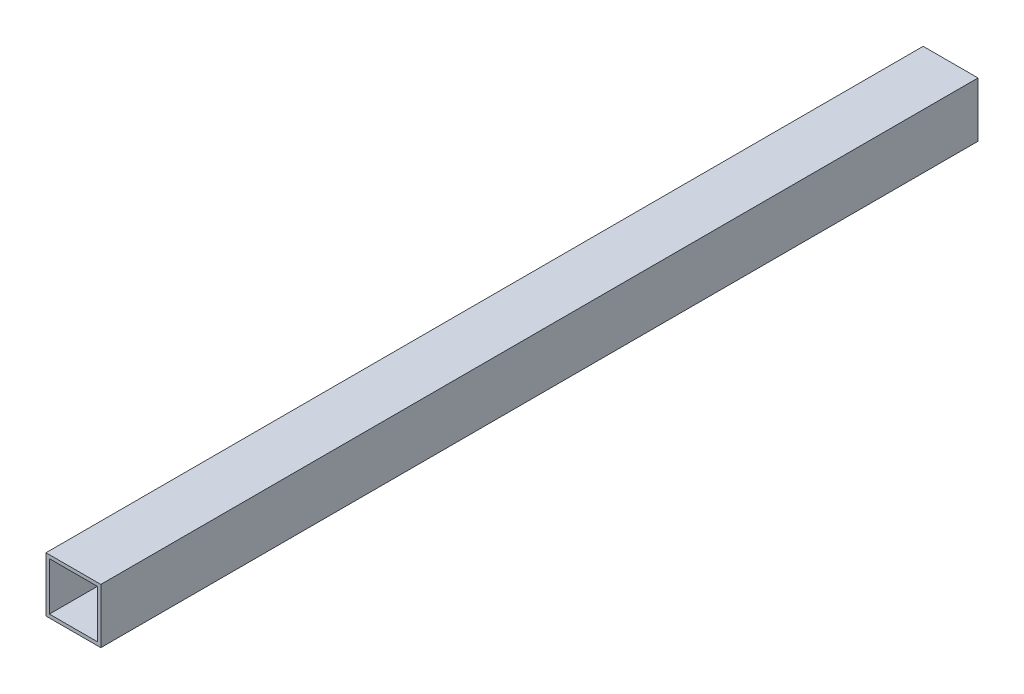
ISO-10303-21;
HEADER;
FILE_DESCRIPTION(('STEP AP214'),'2;1');
FILE_NAME('part.step','',(''),(''),'','','');
FILE_SCHEMA(('AUTOMOTIVE_DESIGN { 1 0 10303 214 1 1 1 1 }'));
ENDSEC;
DATA;
#1=APPLICATION_CONTEXT('core data for automotive mechanical design processes');
#2=APPLICATION_PROTOCOL_DEFINITION('international standard','automotive_design',2000,#1);
#3=PRODUCT_CONTEXT('',#1,'mechanical');
#4=PRODUCT('Part','Part','',(#3));
#5=PRODUCT_RELATED_PRODUCT_CATEGORY('part','',(#4));
#6=PRODUCT_DEFINITION_FORMATION('','',#4);
#7=PRODUCT_DEFINITION_CONTEXT('part definition',#1,'design');
#8=PRODUCT_DEFINITION('design','',#6,#7);
#9=PRODUCT_DEFINITION_SHAPE('','',#8);
#10=(LENGTH_UNIT() NAMED_UNIT(*) SI_UNIT(.MILLI.,.METRE.));
#11=(NAMED_UNIT(*) PLANE_ANGLE_UNIT() SI_UNIT($,.RADIAN.));
#12=(NAMED_UNIT(*) SI_UNIT($,.STERADIAN.) SOLID_ANGLE_UNIT());
#13=UNCERTAINTY_MEASURE_WITH_UNIT(LENGTH_MEASURE(1.E-05),#10,'distance_accuracy_value','');
#14=(GEOMETRIC_REPRESENTATION_CONTEXT(3) GLOBAL_UNCERTAINTY_ASSIGNED_CONTEXT((#13)) GLOBAL_UNIT_ASSIGNED_CONTEXT((#10,
#11,#12)) REPRESENTATION_CONTEXT('',''));
#15=CARTESIAN_POINT('',(0.,0.,0.));
#16=DIRECTION('',(0.,0.,1.));
#17=DIRECTION('',(1.,0.,0.));
#18=AXIS2_PLACEMENT_3D('',#15,#16,#17);
#19=CARTESIAN_POINT('',(0.,0.,812.8));
#20=DIRECTION('',(0.,0.,-1.));
#21=DIRECTION('',(-1.,0.,0.));
#22=AXIS2_PLACEMENT_3D('',#19,#20,#21);
#23=PLANE('',#22);
#24=DIRECTION('',(0.,1.,0.));
#25=VECTOR('',#24,1.);
#26=CARTESIAN_POINT('',(25.4,-25.4,812.8));
#27=LINE('',#26,#25);
#28=CARTESIAN_POINT('',(25.4,-25.4,812.8));
#29=VERTEX_POINT('',#28);
#30=CARTESIAN_POINT('',(25.4,25.4,812.8));
#31=VERTEX_POINT('',#30);
#32=EDGE_CURVE('E134',#29,#31,#27,.T.);
#33=ORIENTED_EDGE('',*,*,#32,.T.);
#34=DIRECTION('',(-1.,0.,0.));
#35=VECTOR('',#34,1.);
#36=CARTESIAN_POINT('',(-25.4,25.4,812.8));
#37=LINE('',#36,#35);
#38=CARTESIAN_POINT('',(-25.4,25.4,812.8));
#39=VERTEX_POINT('',#38);
#40=EDGE_CURVE('E137',#31,#39,#37,.T.);
#41=ORIENTED_EDGE('',*,*,#40,.T.);
#42=DIRECTION('',(0.,-1.,0.));
#43=VECTOR('',#42,1.);
#44=CARTESIAN_POINT('',(-25.4,-25.4,812.8));
#45=LINE('',#44,#43);
#46=CARTESIAN_POINT('',(-25.4,-25.4,812.8));
#47=VERTEX_POINT('',#46);
#48=EDGE_CURVE('E140',#39,#47,#45,.T.);
#49=ORIENTED_EDGE('',*,*,#48,.T.);
#50=DIRECTION('',(1.,0.,0.));
#51=VECTOR('',#50,1.);
#52=CARTESIAN_POINT('',(-25.4,-25.4,812.8));
#53=LINE('',#52,#51);
#54=EDGE_CURVE('E142',#47,#29,#53,.T.);
#55=ORIENTED_EDGE('',*,*,#54,.T.);
#56=EDGE_LOOP('',(#33,#41,#49,#55));
#57=FACE_BOUND('',#56,.T.);
#58=DIRECTION('',(0.,1.,0.));
#59=VECTOR('',#58,1.);
#60=CARTESIAN_POINT('',(22.225,-22.225,812.8));
#61=LINE('',#60,#59);
#62=CARTESIAN_POINT('',(22.225,-22.225,812.8));
#63=VERTEX_POINT('',#62);
#64=CARTESIAN_POINT('',(22.225,22.225,812.8));
#65=VERTEX_POINT('',#64);
#66=EDGE_CURVE('E98',#63,#65,#61,.T.);
#67=ORIENTED_EDGE('',*,*,#66,.F.);
#68=DIRECTION('',(1.,0.,0.));
#69=VECTOR('',#68,1.);
#70=CARTESIAN_POINT('',(-22.225,-22.225,812.8));
#71=LINE('',#70,#69);
#72=CARTESIAN_POINT('',(-22.225,-22.225,812.8));
#73=VERTEX_POINT('',#72);
#74=EDGE_CURVE('E120',#73,#63,#71,.T.);
#75=ORIENTED_EDGE('',*,*,#74,.F.);
#76=DIRECTION('',(0.,-1.,0.));
#77=VECTOR('',#76,1.);
#78=CARTESIAN_POINT('',(-22.225,-22.225,812.8));
#79=LINE('',#78,#77);
#80=CARTESIAN_POINT('',(-22.225,22.225,812.8));
#81=VERTEX_POINT('',#80);
#82=EDGE_CURVE('E118',#81,#73,#79,.T.);
#83=ORIENTED_EDGE('',*,*,#82,.F.);
#84=DIRECTION('',(-1.,0.,0.));
#85=VECTOR('',#84,1.);
#86=CARTESIAN_POINT('',(-22.225,22.225,812.8));
#87=LINE('',#86,#85);
#88=EDGE_CURVE('E106',#65,#81,#87,.T.);
#89=ORIENTED_EDGE('',*,*,#88,.F.);
#90=EDGE_LOOP('',(#67,#75,#83,#89));
#91=FACE_BOUND('',#90,.T.);
#92=ADVANCED_FACE('F33',(#57,#91),#23,.F.);
#93=CARTESIAN_POINT('',(0.,0.,0.));
#94=DIRECTION('',(0.,0.,-1.));
#95=DIRECTION('',(-1.,0.,0.));
#96=AXIS2_PLACEMENT_3D('',#93,#94,#95);
#97=PLANE('',#96);
#98=DIRECTION('',(0.,1.,0.));
#99=VECTOR('',#98,1.);
#100=CARTESIAN_POINT('',(25.4,-25.4,0.));
#101=LINE('',#100,#99);
#102=CARTESIAN_POINT('',(25.4,-25.4,0.));
#103=VERTEX_POINT('',#102);
#104=CARTESIAN_POINT('',(25.4,25.4,0.));
#105=VERTEX_POINT('',#104);
#106=EDGE_CURVE('E114',#103,#105,#101,.T.);
#107=ORIENTED_EDGE('',*,*,#106,.F.);
#108=DIRECTION('',(1.,0.,0.));
#109=VECTOR('',#108,1.);
#110=CARTESIAN_POINT('',(-25.4,-25.4,0.));
#111=LINE('',#110,#109);
#112=CARTESIAN_POINT('',(-25.4,-25.4,0.));
#113=VERTEX_POINT('',#112);
#114=EDGE_CURVE('E138',#113,#103,#111,.T.);
#115=ORIENTED_EDGE('',*,*,#114,.F.);
#116=DIRECTION('',(0.,-1.,0.));
#117=VECTOR('',#116,1.);
#118=CARTESIAN_POINT('',(-25.4,-25.4,0.));
#119=LINE('',#118,#117);
#120=CARTESIAN_POINT('',(-25.4,25.4,0.));
#121=VERTEX_POINT('',#120);
#122=EDGE_CURVE('E149',#121,#113,#119,.T.);
#123=ORIENTED_EDGE('',*,*,#122,.F.);
#124=DIRECTION('',(-1.,0.,0.));
#125=VECTOR('',#124,1.);
#126=CARTESIAN_POINT('',(-25.4,25.4,0.));
#127=LINE('',#126,#125);
#128=EDGE_CURVE('E147',#105,#121,#127,.T.);
#129=ORIENTED_EDGE('',*,*,#128,.F.);
#130=EDGE_LOOP('',(#107,#115,#123,#129));
#131=FACE_BOUND('',#130,.T.);
#132=DIRECTION('',(1.,0.,0.));
#133=VECTOR('',#132,1.);
#134=CARTESIAN_POINT('',(-22.225,-22.225,0.));
#135=LINE('',#134,#133);
#136=CARTESIAN_POINT('',(-22.225,-22.225,0.));
#137=VERTEX_POINT('',#136);
#138=CARTESIAN_POINT('',(22.225,-22.225,0.));
#139=VERTEX_POINT('',#138);
#140=EDGE_CURVE('E107',#137,#139,#135,.T.);
#141=ORIENTED_EDGE('',*,*,#140,.T.);
#142=DIRECTION('',(0.,1.,0.));
#143=VECTOR('',#142,1.);
#144=CARTESIAN_POINT('',(22.225,-22.225,0.));
#145=LINE('',#144,#143);
#146=CARTESIAN_POINT('',(22.225,22.225,0.));
#147=VERTEX_POINT('',#146);
#148=EDGE_CURVE('E56',#139,#147,#145,.T.);
#149=ORIENTED_EDGE('',*,*,#148,.T.);
#150=DIRECTION('',(-1.,0.,0.));
#151=VECTOR('',#150,1.);
#152=CARTESIAN_POINT('',(-22.225,22.225,0.));
#153=LINE('',#152,#151);
#154=CARTESIAN_POINT('',(-22.225,22.225,0.));
#155=VERTEX_POINT('',#154);
#156=EDGE_CURVE('E113',#147,#155,#153,.T.);
#157=ORIENTED_EDGE('',*,*,#156,.T.);
#158=DIRECTION('',(0.,-1.,0.));
#159=VECTOR('',#158,1.);
#160=CARTESIAN_POINT('',(-22.225,-22.225,0.));
#161=LINE('',#160,#159);
#162=EDGE_CURVE('E126',#155,#137,#161,.T.);
#163=ORIENTED_EDGE('',*,*,#162,.T.);
#164=EDGE_LOOP('',(#141,#149,#157,#163));
#165=FACE_BOUND('',#164,.T.);
#166=ADVANCED_FACE('F167',(#131,#165),#97,.T.);
#167=CARTESIAN_POINT('',(25.4,-25.4,812.8));
#168=DIRECTION('',(-1.,0.,0.));
#169=DIRECTION('',(0.,0.,1.));
#170=AXIS2_PLACEMENT_3D('',#167,#168,#169);
#171=PLANE('',#170);
#172=ORIENTED_EDGE('',*,*,#106,.T.);
#173=DIRECTION('',(0.,0.,-1.));
#174=VECTOR('',#173,1.);
#175=CARTESIAN_POINT('',(25.4,25.4,812.8));
#176=LINE('',#175,#174);
#177=EDGE_CURVE('E11',#31,#105,#176,.T.);
#178=ORIENTED_EDGE('',*,*,#177,.F.);
#179=ORIENTED_EDGE('',*,*,#32,.F.);
#180=DIRECTION('',(0.,0.,-1.));
#181=VECTOR('',#180,1.);
#182=CARTESIAN_POINT('',(25.4,-25.4,812.8));
#183=LINE('',#182,#181);
#184=EDGE_CURVE('E144',#29,#103,#183,.T.);
#185=ORIENTED_EDGE('',*,*,#184,.T.);
#186=EDGE_LOOP('',(#172,#178,#179,#185));
#187=FACE_BOUND('',#186,.T.);
#188=ADVANCED_FACE('F35',(#187),#171,.F.);
#189=CARTESIAN_POINT('',(-25.4,25.4,812.8));
#190=DIRECTION('',(0.,-1.,0.));
#191=DIRECTION('',(0.,0.,-1.));
#192=AXIS2_PLACEMENT_3D('',#189,#190,#191);
#193=PLANE('',#192);
#194=ORIENTED_EDGE('',*,*,#128,.T.);
#195=DIRECTION('',(0.,0.,-1.));
#196=VECTOR('',#195,1.);
#197=CARTESIAN_POINT('',(-25.4,25.4,812.8));
#198=LINE('',#197,#196);
#199=EDGE_CURVE('E41',#39,#121,#198,.T.);
#200=ORIENTED_EDGE('',*,*,#199,.F.);
#201=ORIENTED_EDGE('',*,*,#40,.F.);
#202=ORIENTED_EDGE('',*,*,#177,.T.);
#203=EDGE_LOOP('',(#194,#200,#201,#202));
#204=FACE_BOUND('',#203,.T.);
#205=ADVANCED_FACE('F177',(#204),#193,.F.);
#206=CARTESIAN_POINT('',(-25.4,-25.4,812.8));
#207=DIRECTION('',(1.,0.,0.));
#208=DIRECTION('',(0.,0.,-1.));
#209=AXIS2_PLACEMENT_3D('',#206,#207,#208);
#210=PLANE('',#209);
#211=ORIENTED_EDGE('',*,*,#122,.T.);
#212=DIRECTION('',(0.,0.,-1.));
#213=VECTOR('',#212,1.);
#214=CARTESIAN_POINT('',(-25.4,-25.4,812.8));
#215=LINE('',#214,#213);
#216=EDGE_CURVE('E154',#47,#113,#215,.T.);
#217=ORIENTED_EDGE('',*,*,#216,.F.);
#218=ORIENTED_EDGE('',*,*,#48,.F.);
#219=ORIENTED_EDGE('',*,*,#199,.T.);
#220=EDGE_LOOP('',(#211,#217,#218,#219));
#221=FACE_BOUND('',#220,.T.);
#222=ADVANCED_FACE('F161',(#221),#210,.F.);
#223=CARTESIAN_POINT('',(-25.4,-25.4,812.8));
#224=DIRECTION('',(0.,1.,0.));
#225=DIRECTION('',(0.,0.,1.));
#226=AXIS2_PLACEMENT_3D('',#223,#224,#225);
#227=PLANE('',#226);
#228=ORIENTED_EDGE('',*,*,#114,.T.);
#229=ORIENTED_EDGE('',*,*,#184,.F.);
#230=ORIENTED_EDGE('',*,*,#54,.F.);
#231=ORIENTED_EDGE('',*,*,#216,.T.);
#232=EDGE_LOOP('',(#228,#229,#230,#231));
#233=FACE_BOUND('',#232,.T.);
#234=ADVANCED_FACE('F171',(#233),#227,.F.);
#235=CARTESIAN_POINT('',(22.225,-22.225,812.8));
#236=DIRECTION('',(-1.,0.,0.));
#237=DIRECTION('',(0.,0.,1.));
#238=AXIS2_PLACEMENT_3D('',#235,#236,#237);
#239=PLANE('',#238);
#240=ORIENTED_EDGE('',*,*,#148,.F.);
#241=DIRECTION('',(0.,0.,-1.));
#242=VECTOR('',#241,1.);
#243=CARTESIAN_POINT('',(22.225,-22.225,812.8));
#244=LINE('',#243,#242);
#245=EDGE_CURVE('E102',#63,#139,#244,.T.);
#246=ORIENTED_EDGE('',*,*,#245,.F.);
#247=ORIENTED_EDGE('',*,*,#66,.T.);
#248=DIRECTION('',(0.,0.,-1.));
#249=VECTOR('',#248,1.);
#250=CARTESIAN_POINT('',(22.225,22.225,812.8));
#251=LINE('',#250,#249);
#252=EDGE_CURVE('E101',#65,#147,#251,.T.);
#253=ORIENTED_EDGE('',*,*,#252,.T.);
#254=EDGE_LOOP('',(#240,#246,#247,#253));
#255=FACE_BOUND('',#254,.T.);
#256=ADVANCED_FACE('F100',(#255),#239,.T.);
#257=CARTESIAN_POINT('',(-22.225,22.225,812.8));
#258=DIRECTION('',(0.,-1.,0.));
#259=DIRECTION('',(0.,0.,-1.));
#260=AXIS2_PLACEMENT_3D('',#257,#258,#259);
#261=PLANE('',#260);
#262=ORIENTED_EDGE('',*,*,#156,.F.);
#263=ORIENTED_EDGE('',*,*,#252,.F.);
#264=ORIENTED_EDGE('',*,*,#88,.T.);
#265=DIRECTION('',(0.,0.,-1.));
#266=VECTOR('',#265,1.);
#267=CARTESIAN_POINT('',(-22.225,22.225,812.8));
#268=LINE('',#267,#266);
#269=EDGE_CURVE('E115',#81,#155,#268,.T.);
#270=ORIENTED_EDGE('',*,*,#269,.T.);
#271=EDGE_LOOP('',(#262,#263,#264,#270));
#272=FACE_BOUND('',#271,.T.);
#273=ADVANCED_FACE('F110',(#272),#261,.T.);
#274=CARTESIAN_POINT('',(-22.225,-22.225,812.8));
#275=DIRECTION('',(1.,0.,0.));
#276=DIRECTION('',(0.,0.,-1.));
#277=AXIS2_PLACEMENT_3D('',#274,#275,#276);
#278=PLANE('',#277);
#279=ORIENTED_EDGE('',*,*,#162,.F.);
#280=ORIENTED_EDGE('',*,*,#269,.F.);
#281=ORIENTED_EDGE('',*,*,#82,.T.);
#282=DIRECTION('',(0.,0.,-1.));
#283=VECTOR('',#282,1.);
#284=CARTESIAN_POINT('',(-22.225,-22.225,812.8));
#285=LINE('',#284,#283);
#286=EDGE_CURVE('E48',#73,#137,#285,.T.);
#287=ORIENTED_EDGE('',*,*,#286,.T.);
#288=EDGE_LOOP('',(#279,#280,#281,#287));
#289=FACE_BOUND('',#288,.T.);
#290=ADVANCED_FACE('F200',(#289),#278,.T.);
#291=CARTESIAN_POINT('',(-22.225,-22.225,812.8));
#292=DIRECTION('',(0.,1.,0.));
#293=DIRECTION('',(0.,0.,1.));
#294=AXIS2_PLACEMENT_3D('',#291,#292,#293);
#295=PLANE('',#294);
#296=ORIENTED_EDGE('',*,*,#140,.F.);
#297=ORIENTED_EDGE('',*,*,#286,.F.);
#298=ORIENTED_EDGE('',*,*,#74,.T.);
#299=ORIENTED_EDGE('',*,*,#245,.T.);
#300=EDGE_LOOP('',(#296,#297,#298,#299));
#301=FACE_BOUND('',#300,.T.);
#302=ADVANCED_FACE('F204',(#301),#295,.T.);
#303=CLOSED_SHELL('',(#92,#166,#188,#205,#222,#234,#256,#273,#290,#302));
#304=MANIFOLD_SOLID_BREP('B2',#303);
#305=ADVANCED_BREP_SHAPE_REPRESENTATION('',(#18,#304),#14);
#306=SHAPE_DEFINITION_REPRESENTATION(#9,#305);
ENDSEC;
END-ISO-10303-21;
